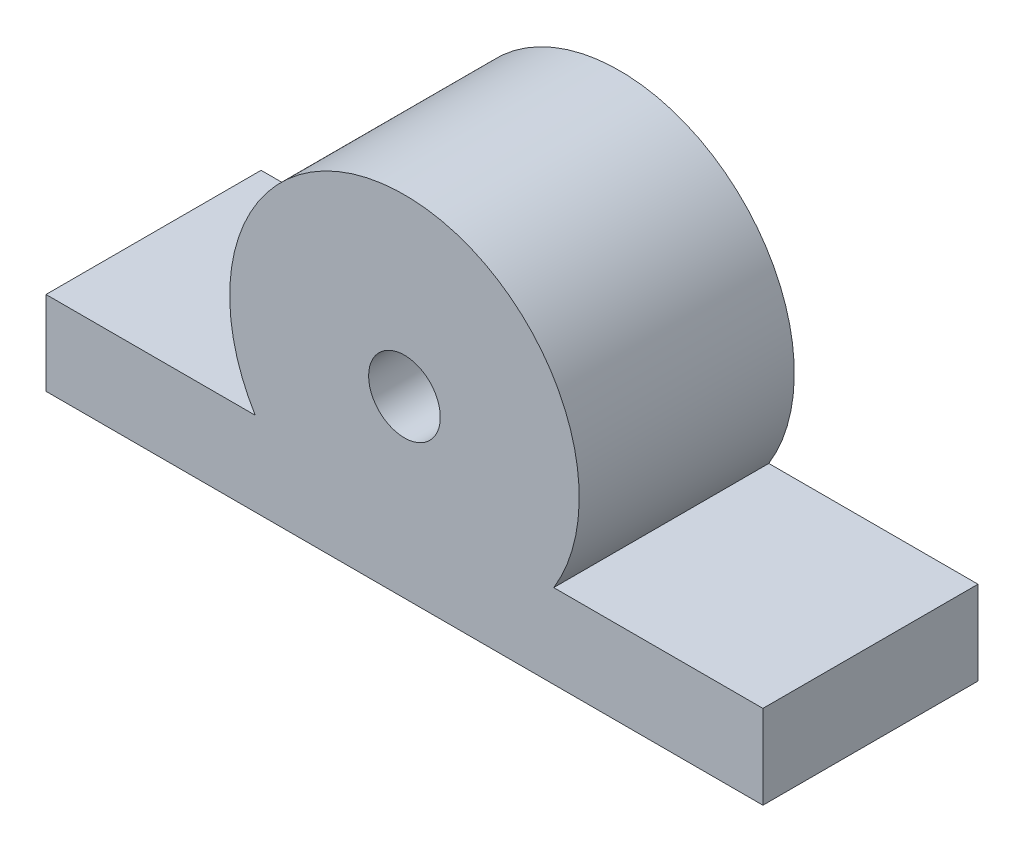
ISO-10303-21;
HEADER;
FILE_DESCRIPTION(('STEP AP214'),'2;1');
FILE_NAME('part.step','',(''),(''),'','','');
FILE_SCHEMA(('AUTOMOTIVE_DESIGN { 1 0 10303 214 1 1 1 1 }'));
ENDSEC;
DATA;
#1=APPLICATION_CONTEXT('core data for automotive mechanical design processes');
#2=APPLICATION_PROTOCOL_DEFINITION('international standard','automotive_design',2000,#1);
#3=PRODUCT_CONTEXT('',#1,'mechanical');
#4=PRODUCT('Part','Part','',(#3));
#5=PRODUCT_RELATED_PRODUCT_CATEGORY('part','',(#4));
#6=PRODUCT_DEFINITION_FORMATION('','',#4);
#7=PRODUCT_DEFINITION_CONTEXT('part definition',#1,'design');
#8=PRODUCT_DEFINITION('design','',#6,#7);
#9=PRODUCT_DEFINITION_SHAPE('','',#8);
#10=(LENGTH_UNIT() NAMED_UNIT(*) SI_UNIT(.MILLI.,.METRE.));
#11=(NAMED_UNIT(*) PLANE_ANGLE_UNIT() SI_UNIT($,.RADIAN.));
#12=(NAMED_UNIT(*) SI_UNIT($,.STERADIAN.) SOLID_ANGLE_UNIT());
#13=UNCERTAINTY_MEASURE_WITH_UNIT(LENGTH_MEASURE(1.E-05),#10,'distance_accuracy_value','');
#14=(GEOMETRIC_REPRESENTATION_CONTEXT(3) GLOBAL_UNCERTAINTY_ASSIGNED_CONTEXT((#13)) GLOBAL_UNIT_ASSIGNED_CONTEXT((#10,
#11,#12)) REPRESENTATION_CONTEXT('',''));
#15=CARTESIAN_POINT('',(0.,0.,0.));
#16=DIRECTION('',(0.,0.,1.));
#17=DIRECTION('',(1.,0.,0.));
#18=AXIS2_PLACEMENT_3D('',#15,#16,#17);
#19=CARTESIAN_POINT('',(0.,0.,38.1));
#20=DIRECTION('',(0.,0.,1.));
#21=DIRECTION('',(1.,0.,0.));
#22=AXIS2_PLACEMENT_3D('',#19,#20,#21);
#23=PLANE('',#22);
#24=CARTESIAN_POINT('',(0.,0.,38.1));
#25=DIRECTION('',(0.,0.,1.));
#26=DIRECTION('',(1.,0.,0.));
#27=AXIS2_PLACEMENT_3D('',#24,#25,#26);
#28=CIRCLE('',#27,30.95625);
#29=CARTESIAN_POINT('',(26.4431064693544,-16.0950779529919,38.1));
#30=VERTEX_POINT('',#29);
#31=CARTESIAN_POINT('',(-26.4431064693544,-16.0950779529919,38.1));
#32=VERTEX_POINT('',#31);
#33=EDGE_CURVE('E137',#30,#32,#28,.T.);
#34=ORIENTED_EDGE('',*,*,#33,.T.);
#35=DIRECTION('',(-1.,0.,0.));
#36=VECTOR('',#35,1.);
#37=CARTESIAN_POINT('',(-63.5,-16.0950779529919,38.1));
#38=LINE('',#37,#36);
#39=CARTESIAN_POINT('',(-63.5,-16.0950779529919,38.1));
#40=VERTEX_POINT('',#39);
#41=EDGE_CURVE('E95',#32,#40,#38,.T.);
#42=ORIENTED_EDGE('',*,*,#41,.T.);
#43=DIRECTION('',(0.,-1.,0.));
#44=VECTOR('',#43,1.);
#45=CARTESIAN_POINT('',(-63.5,-30.95625,38.1));
#46=LINE('',#45,#44);
#47=CARTESIAN_POINT('',(-63.5,-30.95625,38.1));
#48=VERTEX_POINT('',#47);
#49=EDGE_CURVE('E108',#40,#48,#46,.T.);
#50=ORIENTED_EDGE('',*,*,#49,.T.);
#51=DIRECTION('',(1.,0.,0.));
#52=VECTOR('',#51,1.);
#53=CARTESIAN_POINT('',(-63.5,-30.95625,38.1));
#54=LINE('',#53,#52);
#55=CARTESIAN_POINT('',(63.5,-30.95625,38.1));
#56=VERTEX_POINT('',#55);
#57=EDGE_CURVE('E102',#48,#56,#54,.T.);
#58=ORIENTED_EDGE('',*,*,#57,.T.);
#59=DIRECTION('',(0.,1.,0.));
#60=VECTOR('',#59,1.);
#61=CARTESIAN_POINT('',(63.5,-30.95625,38.1));
#62=LINE('',#61,#60);
#63=CARTESIAN_POINT('',(63.5,-16.0950779529919,38.1));
#64=VERTEX_POINT('',#63);
#65=EDGE_CURVE('E106',#56,#64,#62,.T.);
#66=ORIENTED_EDGE('',*,*,#65,.T.);
#67=DIRECTION('',(-1.,0.,0.));
#68=VECTOR('',#67,1.);
#69=CARTESIAN_POINT('',(26.4431064693544,-16.0950779529919,38.1));
#70=LINE('',#69,#68);
#71=EDGE_CURVE('E58',#64,#30,#70,.T.);
#72=ORIENTED_EDGE('',*,*,#71,.T.);
#73=EDGE_LOOP('',(#34,#42,#50,#58,#66,#72));
#74=FACE_BOUND('',#73,.T.);
#75=CARTESIAN_POINT('',(0.,0.,38.1));
#76=DIRECTION('',(0.,0.,1.));
#77=DIRECTION('',(1.,0.,0.));
#78=AXIS2_PLACEMENT_3D('',#75,#76,#77);
#79=CIRCLE('',#78,6.35);
#80=CARTESIAN_POINT('',(-6.35,0.,38.1));
#81=VERTEX_POINT('',#80);
#82=EDGE_CURVE('E130',#81,#81,#79,.T.);
#83=ORIENTED_EDGE('',*,*,#82,.F.);
#84=EDGE_LOOP('',(#83));
#85=FACE_BOUND('',#84,.T.);
#86=ADVANCED_FACE('F41',(#74,#85),#23,.T.);
#87=CARTESIAN_POINT('',(0.,0.,0.));
#88=DIRECTION('',(0.,0.,1.));
#89=DIRECTION('',(1.,0.,0.));
#90=AXIS2_PLACEMENT_3D('',#87,#88,#89);
#91=PLANE('',#90);
#92=CARTESIAN_POINT('',(0.,0.,0.));
#93=DIRECTION('',(0.,0.,1.));
#94=DIRECTION('',(1.,0.,0.));
#95=AXIS2_PLACEMENT_3D('',#92,#93,#94);
#96=CIRCLE('',#95,30.95625);
#97=CARTESIAN_POINT('',(26.4431064693544,-16.0950779529919,0.));
#98=VERTEX_POINT('',#97);
#99=CARTESIAN_POINT('',(-26.4431064693544,-16.0950779529919,0.));
#100=VERTEX_POINT('',#99);
#101=EDGE_CURVE('E126',#98,#100,#96,.T.);
#102=ORIENTED_EDGE('',*,*,#101,.F.);
#103=DIRECTION('',(-1.,0.,0.));
#104=VECTOR('',#103,1.);
#105=CARTESIAN_POINT('',(26.4431064693544,-16.0950779529919,0.));
#106=LINE('',#105,#104);
#107=CARTESIAN_POINT('',(63.5,-16.0950779529919,0.));
#108=VERTEX_POINT('',#107);
#109=EDGE_CURVE('E87',#108,#98,#106,.T.);
#110=ORIENTED_EDGE('',*,*,#109,.F.);
#111=DIRECTION('',(0.,1.,0.));
#112=VECTOR('',#111,1.);
#113=CARTESIAN_POINT('',(63.5,-30.95625,0.));
#114=LINE('',#113,#112);
#115=CARTESIAN_POINT('',(63.5,-30.95625,0.));
#116=VERTEX_POINT('',#115);
#117=EDGE_CURVE('E81',#116,#108,#114,.T.);
#118=ORIENTED_EDGE('',*,*,#117,.F.);
#119=DIRECTION('',(1.,0.,0.));
#120=VECTOR('',#119,1.);
#121=CARTESIAN_POINT('',(-63.5,-30.95625,0.));
#122=LINE('',#121,#120);
#123=CARTESIAN_POINT('',(-63.5,-30.95625,0.));
#124=VERTEX_POINT('',#123);
#125=EDGE_CURVE('E116',#124,#116,#122,.T.);
#126=ORIENTED_EDGE('',*,*,#125,.F.);
#127=DIRECTION('',(0.,-1.,0.));
#128=VECTOR('',#127,1.);
#129=CARTESIAN_POINT('',(-63.5,-30.95625,0.));
#130=LINE('',#129,#128);
#131=CARTESIAN_POINT('',(-63.5,-16.0950779529919,0.));
#132=VERTEX_POINT('',#131);
#133=EDGE_CURVE('E132',#132,#124,#130,.T.);
#134=ORIENTED_EDGE('',*,*,#133,.F.);
#135=DIRECTION('',(-1.,0.,0.));
#136=VECTOR('',#135,1.);
#137=CARTESIAN_POINT('',(-63.5,-16.0950779529919,0.));
#138=LINE('',#137,#136);
#139=EDGE_CURVE('E129',#100,#132,#138,.T.);
#140=ORIENTED_EDGE('',*,*,#139,.F.);
#141=EDGE_LOOP('',(#102,#110,#118,#126,#134,#140));
#142=FACE_BOUND('',#141,.T.);
#143=CARTESIAN_POINT('',(0.,0.,0.));
#144=DIRECTION('',(0.,0.,1.));
#145=DIRECTION('',(1.,0.,0.));
#146=AXIS2_PLACEMENT_3D('',#143,#144,#145);
#147=CIRCLE('',#146,6.35);
#148=CARTESIAN_POINT('',(-6.35,0.,0.));
#149=VERTEX_POINT('',#148);
#150=EDGE_CURVE('E251',#149,#149,#147,.T.);
#151=ORIENTED_EDGE('',*,*,#150,.T.);
#152=EDGE_LOOP('',(#151));
#153=FACE_BOUND('',#152,.T.);
#154=ADVANCED_FACE('F146',(#142,#153),#91,.F.);
#155=CARTESIAN_POINT('',(0.,0.,38.1));
#156=DIRECTION('',(0.,0.,-1.));
#157=DIRECTION('',(-1.,0.,0.));
#158=AXIS2_PLACEMENT_3D('',#155,#156,#157);
#159=CYLINDRICAL_SURFACE('',#158,30.95625);
#160=ORIENTED_EDGE('',*,*,#101,.T.);
#161=DIRECTION('',(0.,0.,-1.));
#162=VECTOR('',#161,1.);
#163=CARTESIAN_POINT('',(-26.4431064693544,-16.0950779529919,38.1));
#164=LINE('',#163,#162);
#165=EDGE_CURVE('E11',#32,#100,#164,.T.);
#166=ORIENTED_EDGE('',*,*,#165,.F.);
#167=ORIENTED_EDGE('',*,*,#33,.F.);
#168=DIRECTION('',(0.,0.,-1.));
#169=VECTOR('',#168,1.);
#170=CARTESIAN_POINT('',(26.4431064693544,-16.0950779529919,38.1));
#171=LINE('',#170,#169);
#172=EDGE_CURVE('E122',#30,#98,#171,.T.);
#173=ORIENTED_EDGE('',*,*,#172,.T.);
#174=EDGE_LOOP('',(#160,#166,#167,#173));
#175=FACE_BOUND('',#174,.T.);
#176=ADVANCED_FACE('F43',(#175),#159,.T.);
#177=CARTESIAN_POINT('',(-63.5,-16.0950779529919,38.1));
#178=DIRECTION('',(0.,-1.,0.));
#179=DIRECTION('',(0.,0.,-1.));
#180=AXIS2_PLACEMENT_3D('',#177,#178,#179);
#181=PLANE('',#180);
#182=ORIENTED_EDGE('',*,*,#139,.T.);
#183=DIRECTION('',(0.,0.,-1.));
#184=VECTOR('',#183,1.);
#185=CARTESIAN_POINT('',(-63.5,-16.0950779529919,38.1));
#186=LINE('',#185,#184);
#187=EDGE_CURVE('E50',#40,#132,#186,.T.);
#188=ORIENTED_EDGE('',*,*,#187,.F.);
#189=ORIENTED_EDGE('',*,*,#41,.F.);
#190=ORIENTED_EDGE('',*,*,#165,.T.);
#191=EDGE_LOOP('',(#182,#188,#189,#190));
#192=FACE_BOUND('',#191,.T.);
#193=ADVANCED_FACE('F171',(#192),#181,.F.);
#194=CARTESIAN_POINT('',(-63.5,-30.95625,38.1));
#195=DIRECTION('',(1.,0.,0.));
#196=DIRECTION('',(0.,0.,-1.));
#197=AXIS2_PLACEMENT_3D('',#194,#195,#196);
#198=PLANE('',#197);
#199=ORIENTED_EDGE('',*,*,#133,.T.);
#200=DIRECTION('',(0.,0.,-1.));
#201=VECTOR('',#200,1.);
#202=CARTESIAN_POINT('',(-63.5,-30.95625,38.1));
#203=LINE('',#202,#201);
#204=EDGE_CURVE('E117',#48,#124,#203,.T.);
#205=ORIENTED_EDGE('',*,*,#204,.F.);
#206=ORIENTED_EDGE('',*,*,#49,.F.);
#207=ORIENTED_EDGE('',*,*,#187,.T.);
#208=EDGE_LOOP('',(#199,#205,#206,#207));
#209=FACE_BOUND('',#208,.T.);
#210=ADVANCED_FACE('F143',(#209),#198,.F.);
#211=CARTESIAN_POINT('',(-63.5,-30.95625,38.1));
#212=DIRECTION('',(0.,1.,0.));
#213=DIRECTION('',(0.,0.,1.));
#214=AXIS2_PLACEMENT_3D('',#211,#212,#213);
#215=PLANE('',#214);
#216=ORIENTED_EDGE('',*,*,#125,.T.);
#217=DIRECTION('',(0.,0.,-1.));
#218=VECTOR('',#217,1.);
#219=CARTESIAN_POINT('',(63.5,-30.95625,38.1));
#220=LINE('',#219,#218);
#221=EDGE_CURVE('E113',#56,#116,#220,.T.);
#222=ORIENTED_EDGE('',*,*,#221,.F.);
#223=ORIENTED_EDGE('',*,*,#57,.F.);
#224=ORIENTED_EDGE('',*,*,#204,.T.);
#225=EDGE_LOOP('',(#216,#222,#223,#224));
#226=FACE_BOUND('',#225,.T.);
#227=ADVANCED_FACE('F114',(#226),#215,.F.);
#228=CARTESIAN_POINT('',(63.5,-30.95625,38.1));
#229=DIRECTION('',(-1.,0.,0.));
#230=DIRECTION('',(0.,0.,1.));
#231=AXIS2_PLACEMENT_3D('',#228,#229,#230);
#232=PLANE('',#231);
#233=ORIENTED_EDGE('',*,*,#117,.T.);
#234=DIRECTION('',(0.,0.,-1.));
#235=VECTOR('',#234,1.);
#236=CARTESIAN_POINT('',(63.5,-16.0950779529919,38.1));
#237=LINE('',#236,#235);
#238=EDGE_CURVE('E118',#64,#108,#237,.T.);
#239=ORIENTED_EDGE('',*,*,#238,.F.);
#240=ORIENTED_EDGE('',*,*,#65,.F.);
#241=ORIENTED_EDGE('',*,*,#221,.T.);
#242=EDGE_LOOP('',(#233,#239,#240,#241));
#243=FACE_BOUND('',#242,.T.);
#244=ADVANCED_FACE('F120',(#243),#232,.F.);
#245=CARTESIAN_POINT('',(26.4431064693544,-16.0950779529919,38.1));
#246=DIRECTION('',(0.,-1.,0.));
#247=DIRECTION('',(0.,0.,-1.));
#248=AXIS2_PLACEMENT_3D('',#245,#246,#247);
#249=PLANE('',#248);
#250=ORIENTED_EDGE('',*,*,#109,.T.);
#251=ORIENTED_EDGE('',*,*,#172,.F.);
#252=ORIENTED_EDGE('',*,*,#71,.F.);
#253=ORIENTED_EDGE('',*,*,#238,.T.);
#254=EDGE_LOOP('',(#250,#251,#252,#253));
#255=FACE_BOUND('',#254,.T.);
#256=ADVANCED_FACE('F151',(#255),#249,.F.);
#257=CARTESIAN_POINT('',(0.,0.,38.1));
#258=DIRECTION('',(0.,0.,-1.));
#259=DIRECTION('',(-1.,0.,0.));
#260=AXIS2_PLACEMENT_3D('',#257,#258,#259);
#261=CYLINDRICAL_SURFACE('',#260,6.35);
#262=CARTESIAN_POINT('',(-6.35,0.,38.1));
#263=CARTESIAN_POINT('',(-6.35,0.,37.703125));
#264=CARTESIAN_POINT('',(-6.35,0.,37.30625));
#265=CARTESIAN_POINT('',(-6.35,0.,36.5125));
#266=CARTESIAN_POINT('',(-6.35,0.,36.115625));
#267=CARTESIAN_POINT('',(-6.35,0.,35.321875));
#268=CARTESIAN_POINT('',(-6.35,0.,34.925));
#269=CARTESIAN_POINT('',(-6.35,0.,34.13125));
#270=CARTESIAN_POINT('',(-6.35,0.,33.734375));
#271=CARTESIAN_POINT('',(-6.35,0.,32.940625));
#272=CARTESIAN_POINT('',(-6.35,0.,32.54375));
#273=CARTESIAN_POINT('',(-6.35,0.,31.75));
#274=CARTESIAN_POINT('',(-6.35,0.,31.353125));
#275=CARTESIAN_POINT('',(-6.35,0.,30.559375));
#276=CARTESIAN_POINT('',(-6.35,0.,30.1625));
#277=CARTESIAN_POINT('',(-6.35,0.,29.36875));
#278=CARTESIAN_POINT('',(-6.35,0.,28.971875));
#279=CARTESIAN_POINT('',(-6.35,0.,28.178125));
#280=CARTESIAN_POINT('',(-6.35,0.,27.78125));
#281=CARTESIAN_POINT('',(-6.35,0.,26.9875));
#282=CARTESIAN_POINT('',(-6.35,0.,26.590625));
#283=CARTESIAN_POINT('',(-6.35,0.,25.796875));
#284=CARTESIAN_POINT('',(-6.35,0.,25.4));
#285=CARTESIAN_POINT('',(-6.35,0.,24.60625));
#286=CARTESIAN_POINT('',(-6.35,0.,24.209375));
#287=CARTESIAN_POINT('',(-6.35,0.,23.415625));
#288=CARTESIAN_POINT('',(-6.35,0.,23.01875));
#289=CARTESIAN_POINT('',(-6.35,0.,22.225));
#290=CARTESIAN_POINT('',(-6.35,0.,21.828125));
#291=CARTESIAN_POINT('',(-6.35,0.,21.034375));
#292=CARTESIAN_POINT('',(-6.35,0.,20.6375));
#293=CARTESIAN_POINT('',(-6.35,0.,19.84375));
#294=CARTESIAN_POINT('',(-6.35,0.,19.446875));
#295=CARTESIAN_POINT('',(-6.35,0.,18.653125));
#296=CARTESIAN_POINT('',(-6.35,0.,18.25625));
#297=CARTESIAN_POINT('',(-6.35,0.,17.4625));
#298=CARTESIAN_POINT('',(-6.35,0.,17.065625));
#299=CARTESIAN_POINT('',(-6.35,0.,16.271875));
#300=CARTESIAN_POINT('',(-6.35,0.,15.875));
#301=CARTESIAN_POINT('',(-6.35,0.,15.08125));
#302=CARTESIAN_POINT('',(-6.35,0.,14.684375));
#303=CARTESIAN_POINT('',(-6.35,0.,13.890625));
#304=CARTESIAN_POINT('',(-6.35,0.,13.49375));
#305=CARTESIAN_POINT('',(-6.35,0.,12.7));
#306=CARTESIAN_POINT('',(-6.35,0.,12.303125));
#307=CARTESIAN_POINT('',(-6.35,0.,11.509375));
#308=CARTESIAN_POINT('',(-6.35,0.,11.1125));
#309=CARTESIAN_POINT('',(-6.35,0.,10.31875));
#310=CARTESIAN_POINT('',(-6.35,0.,9.921875));
#311=CARTESIAN_POINT('',(-6.35,0.,9.128125));
#312=CARTESIAN_POINT('',(-6.35,0.,8.73125));
#313=CARTESIAN_POINT('',(-6.35,0.,7.9375));
#314=CARTESIAN_POINT('',(-6.35,0.,7.540625));
#315=CARTESIAN_POINT('',(-6.35,0.,6.746875));
#316=CARTESIAN_POINT('',(-6.35,0.,6.35));
#317=CARTESIAN_POINT('',(-6.35,0.,5.55625));
#318=CARTESIAN_POINT('',(-6.35,0.,5.159375));
#319=CARTESIAN_POINT('',(-6.35,0.,4.365625));
#320=CARTESIAN_POINT('',(-6.35,0.,3.96875));
#321=CARTESIAN_POINT('',(-6.35,0.,3.175));
#322=CARTESIAN_POINT('',(-6.35,0.,2.778125));
#323=CARTESIAN_POINT('',(-6.35,0.,1.984375));
#324=CARTESIAN_POINT('',(-6.35,0.,1.5875));
#325=CARTESIAN_POINT('',(-6.35,0.,0.79375));
#326=CARTESIAN_POINT('',(-6.35,0.,0.396875));
#327=CARTESIAN_POINT('',(-6.35,0.,0.));
#328=B_SPLINE_CURVE_WITH_KNOTS('',3,(#262,#263,#264,#265,#266,#267,#268,#269,#270,#271,#272,
#273,#274,#275,#276,#277,#278,#279,#280,#281,#282,#283,#284,#285,#286,#287,#288,#289,#290,#291,
#292,#293,#294,#295,#296,#297,#298,#299,#300,#301,#302,#303,#304,#305,#306,#307,#308,#309,#310,
#311,#312,#313,#314,#315,#316,#317,#318,#319,#320,#321,#322,#323,#324,#325,#326,#327),
.UNSPECIFIED.,.F.,.F.,(4,2,2,2,2,2,2,2,2,2,2,2,2,2,2,2,2,2,2,2,2,2,2,2,2,2,2,2,2,2,2,2,4),(0.,
1.19062499999999,2.38124999999999,3.571875,4.7625,5.953125,7.14375,8.33437499999999,9.525,
10.715625,11.90625,13.096875,14.2875,15.478125,16.66875,17.859375,19.05,20.240625,21.43125,
22.621875,23.8125,25.003125,26.19375,27.384375,28.575,29.765625,30.95625,32.146875,33.3375,
34.528125,35.71875,36.909375,38.1),.UNSPECIFIED.);
#329=EDGE_CURVE('BSEAM153',#81,#149,#328,.T.);
#330=ORIENTED_EDGE('',*,*,#82,.T.);
#331=ORIENTED_EDGE('',*,*,#150,.F.);
#332=ORIENTED_EDGE('',*,*,#329,.T.);
#333=ORIENTED_EDGE('',*,*,#329,.F.);
#334=EDGE_LOOP('',(#330,#332,#331,#333));
#335=FACE_BOUND('',#334,.T.);
#336=ADVANCED_FACE('F153',(#335),#261,.F.);
#337=CLOSED_SHELL('',(#86,#154,#176,#193,#210,#227,#244,#256,#336));
#338=MANIFOLD_SOLID_BREP('B2',#337);
#339=ADVANCED_BREP_SHAPE_REPRESENTATION('',(#18,#338),#14);
#340=SHAPE_DEFINITION_REPRESENTATION(#9,#339);
ENDSEC;
END-ISO-10303-21;
